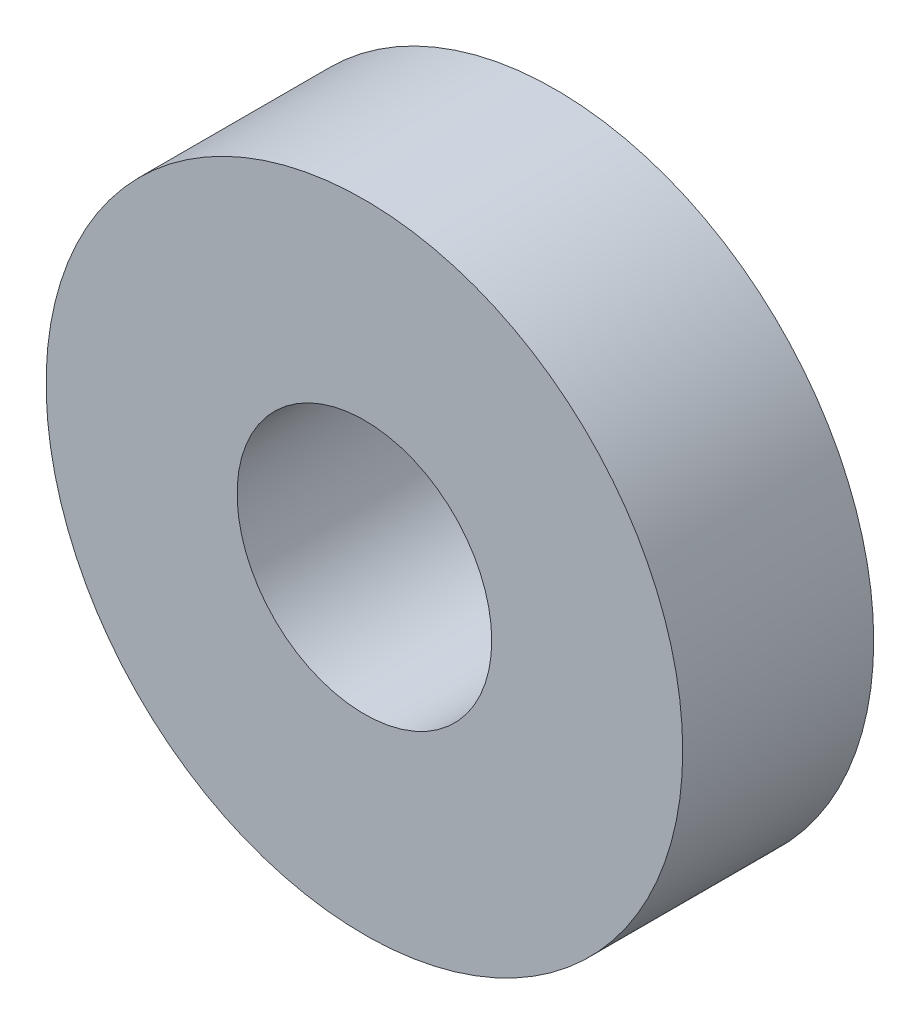
ISO-10303-21;
HEADER;
FILE_DESCRIPTION(('STEP AP214'),'2;1');
FILE_NAME('part.step','',(''),(''),'','','');
FILE_SCHEMA(('AUTOMOTIVE_DESIGN { 1 0 10303 214 1 1 1 1 }'));
ENDSEC;
DATA;
#1=APPLICATION_CONTEXT('core data for automotive mechanical design processes');
#2=APPLICATION_PROTOCOL_DEFINITION('international standard','automotive_design',2000,#1);
#3=PRODUCT_CONTEXT('',#1,'mechanical');
#4=PRODUCT('Part','Part','',(#3));
#5=PRODUCT_RELATED_PRODUCT_CATEGORY('part','',(#4));
#6=PRODUCT_DEFINITION_FORMATION('','',#4);
#7=PRODUCT_DEFINITION_CONTEXT('part definition',#1,'design');
#8=PRODUCT_DEFINITION('design','',#6,#7);
#9=PRODUCT_DEFINITION_SHAPE('','',#8);
#10=(LENGTH_UNIT() NAMED_UNIT(*) SI_UNIT(.MILLI.,.METRE.));
#11=(NAMED_UNIT(*) PLANE_ANGLE_UNIT() SI_UNIT($,.RADIAN.));
#12=(NAMED_UNIT(*) SI_UNIT($,.STERADIAN.) SOLID_ANGLE_UNIT());
#13=UNCERTAINTY_MEASURE_WITH_UNIT(LENGTH_MEASURE(1.E-05),#10,'distance_accuracy_value','');
#14=(GEOMETRIC_REPRESENTATION_CONTEXT(3) GLOBAL_UNCERTAINTY_ASSIGNED_CONTEXT((#13)) GLOBAL_UNIT_ASSIGNED_CONTEXT((#10,
#11,#12)) REPRESENTATION_CONTEXT('',''));
#15=CARTESIAN_POINT('',(0.,0.,0.));
#16=DIRECTION('',(0.,0.,1.));
#17=DIRECTION('',(1.,0.,0.));
#18=AXIS2_PLACEMENT_3D('',#15,#16,#17);
#19=CARTESIAN_POINT('',(0.,0.,2.4));
#20=DIRECTION('',(0.,0.,1.));
#21=DIRECTION('',(1.,0.,0.));
#22=AXIS2_PLACEMENT_3D('',#19,#20,#21);
#23=PLANE('',#22);
#24=CARTESIAN_POINT('',(0.,0.,2.4));
#25=DIRECTION('',(0.,0.,1.));
#26=DIRECTION('',(1.,0.,0.));
#27=AXIS2_PLACEMENT_3D('',#24,#25,#26);
#28=CIRCLE('',#27,4.);
#29=CARTESIAN_POINT('',(4.,0.,2.4));
#30=VERTEX_POINT('',#29);
#31=EDGE_CURVE('E10',#30,#30,#28,.T.);
#32=ORIENTED_EDGE('',*,*,#31,.T.);
#33=EDGE_LOOP('',(#32));
#34=FACE_BOUND('',#33,.T.);
#35=CARTESIAN_POINT('',(0.,0.,2.4));
#36=DIRECTION('',(0.,0.,1.));
#37=DIRECTION('',(1.,0.,0.));
#38=AXIS2_PLACEMENT_3D('',#35,#36,#37);
#39=CIRCLE('',#38,1.6);
#40=CARTESIAN_POINT('',(1.6,0.,2.4));
#41=VERTEX_POINT('',#40);
#42=EDGE_CURVE('E41',#41,#41,#39,.T.);
#43=ORIENTED_EDGE('',*,*,#42,.F.);
#44=EDGE_LOOP('',(#43));
#45=FACE_BOUND('',#44,.T.);
#46=ADVANCED_FACE('F30',(#34,#45),#23,.T.);
#47=CARTESIAN_POINT('',(0.,0.,0.));
#48=DIRECTION('',(0.,0.,1.));
#49=DIRECTION('',(1.,0.,0.));
#50=AXIS2_PLACEMENT_3D('',#47,#48,#49);
#51=PLANE('',#50);
#52=CARTESIAN_POINT('',(0.,0.,0.));
#53=DIRECTION('',(0.,0.,1.));
#54=DIRECTION('',(1.,0.,0.));
#55=AXIS2_PLACEMENT_3D('',#52,#53,#54);
#56=CIRCLE('',#55,4.);
#57=CARTESIAN_POINT('',(4.,0.,0.));
#58=VERTEX_POINT('',#57);
#59=EDGE_CURVE('E34',#58,#58,#56,.T.);
#60=ORIENTED_EDGE('',*,*,#59,.F.);
#61=EDGE_LOOP('',(#60));
#62=FACE_BOUND('',#61,.T.);
#63=CARTESIAN_POINT('',(0.,0.,0.));
#64=DIRECTION('',(0.,0.,1.));
#65=DIRECTION('',(1.,0.,0.));
#66=AXIS2_PLACEMENT_3D('',#63,#64,#65);
#67=CIRCLE('',#66,1.6);
#68=CARTESIAN_POINT('',(1.6,0.,0.));
#69=VERTEX_POINT('',#68);
#70=EDGE_CURVE('E43',#69,#69,#67,.T.);
#71=ORIENTED_EDGE('',*,*,#70,.T.);
#72=EDGE_LOOP('',(#71));
#73=FACE_BOUND('',#72,.T.);
#74=ADVANCED_FACE('F53',(#62,#73),#51,.F.);
#75=CARTESIAN_POINT('',(0.,0.,2.4));
#76=DIRECTION('',(0.,0.,-1.));
#77=DIRECTION('',(-1.,0.,0.));
#78=AXIS2_PLACEMENT_3D('',#75,#76,#77);
#79=CYLINDRICAL_SURFACE('',#78,4.);
#80=ORIENTED_EDGE('',*,*,#31,.F.);
#81=EDGE_LOOP('',(#80));
#82=FACE_BOUND('',#81,.T.);
#83=ORIENTED_EDGE('',*,*,#59,.T.);
#84=EDGE_LOOP('',(#83));
#85=FACE_BOUND('',#84,.T.);
#86=ADVANCED_FACE('F32',(#82,#85),#79,.T.);
#87=CARTESIAN_POINT('',(0.,0.,2.4));
#88=DIRECTION('',(0.,0.,-1.));
#89=DIRECTION('',(-1.,0.,0.));
#90=AXIS2_PLACEMENT_3D('',#87,#88,#89);
#91=CYLINDRICAL_SURFACE('',#90,1.6);
#92=ORIENTED_EDGE('',*,*,#42,.T.);
#93=EDGE_LOOP('',(#92));
#94=FACE_BOUND('',#93,.T.);
#95=ORIENTED_EDGE('',*,*,#70,.F.);
#96=EDGE_LOOP('',(#95));
#97=FACE_BOUND('',#96,.T.);
#98=ADVANCED_FACE('F49',(#94,#97),#91,.F.);
#99=CLOSED_SHELL('',(#46,#74,#86,#98));
#100=MANIFOLD_SOLID_BREP('B2',#99);
#101=ADVANCED_BREP_SHAPE_REPRESENTATION('',(#18,#100),#14);
#102=SHAPE_DEFINITION_REPRESENTATION(#9,#101);
ENDSEC;
END-ISO-10303-21;
